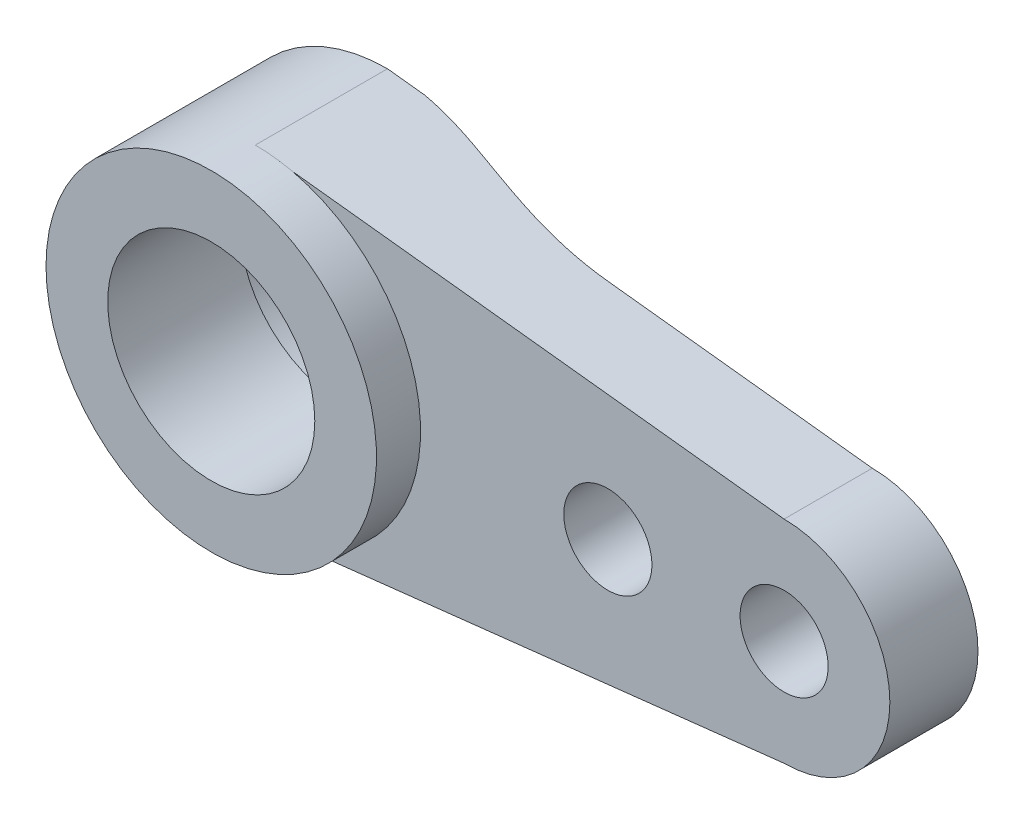
ISO-10303-21;
HEADER;
FILE_DESCRIPTION(('STEP AP214'),'2;1');
FILE_NAME('part.step','',(''),(''),'','','');
FILE_SCHEMA(('AUTOMOTIVE_DESIGN { 1 0 10303 214 1 1 1 1 }'));
ENDSEC;
DATA;
#1=APPLICATION_CONTEXT('core data for automotive mechanical design processes');
#2=APPLICATION_PROTOCOL_DEFINITION('international standard','automotive_design',2000,#1);
#3=PRODUCT_CONTEXT('',#1,'mechanical');
#4=PRODUCT('Part','Part','',(#3));
#5=PRODUCT_RELATED_PRODUCT_CATEGORY('part','',(#4));
#6=PRODUCT_DEFINITION_FORMATION('','',#4);
#7=PRODUCT_DEFINITION_CONTEXT('part definition',#1,'design');
#8=PRODUCT_DEFINITION('design','',#6,#7);
#9=PRODUCT_DEFINITION_SHAPE('','',#8);
#10=(LENGTH_UNIT() NAMED_UNIT(*) SI_UNIT(.MILLI.,.METRE.));
#11=(NAMED_UNIT(*) PLANE_ANGLE_UNIT() SI_UNIT($,.RADIAN.));
#12=(NAMED_UNIT(*) SI_UNIT($,.STERADIAN.) SOLID_ANGLE_UNIT());
#13=UNCERTAINTY_MEASURE_WITH_UNIT(LENGTH_MEASURE(1.E-05),#10,'distance_accuracy_value','');
#14=(GEOMETRIC_REPRESENTATION_CONTEXT(3) GLOBAL_UNCERTAINTY_ASSIGNED_CONTEXT((#13)) GLOBAL_UNIT_ASSIGNED_CONTEXT((#10,
#11,#12)) REPRESENTATION_CONTEXT('',''));
#15=CARTESIAN_POINT('',(0.,0.,0.));
#16=DIRECTION('',(0.,0.,1.));
#17=DIRECTION('',(1.,0.,0.));
#18=AXIS2_PLACEMENT_3D('',#15,#16,#17);
#19=CARTESIAN_POINT('',(0.,0.,0.));
#20=DIRECTION('',(0.,0.,1.));
#21=DIRECTION('',(1.,0.,0.));
#22=AXIS2_PLACEMENT_3D('',#19,#20,#21);
#23=PLANE('',#22);
#24=CARTESIAN_POINT('',(0.,0.,0.));
#25=DIRECTION('',(0.,0.,1.));
#26=DIRECTION('',(1.,0.,0.));
#27=AXIS2_PLACEMENT_3D('',#24,#25,#26);
#28=CIRCLE('',#27,2.35);
#29=CARTESIAN_POINT('',(2.35,0.,0.));
#30=VERTEX_POINT('',#29);
#31=EDGE_CURVE('E140',#30,#30,#28,.T.);
#32=ORIENTED_EDGE('',*,*,#31,.T.);
#33=EDGE_LOOP('',(#32));
#34=FACE_BOUND('',#33,.T.);
#35=CARTESIAN_POINT('',(0.,0.,0.));
#36=DIRECTION('',(0.,0.,-1.));
#37=DIRECTION('',(-1.,0.,0.));
#38=AXIS2_PLACEMENT_3D('',#35,#36,#37);
#39=CIRCLE('',#38,2.75);
#40=CARTESIAN_POINT('',(-2.75,0.,0.));
#41=VERTEX_POINT('',#40);
#42=EDGE_CURVE('E130',#41,#41,#39,.T.);
#43=ORIENTED_EDGE('',*,*,#42,.T.);
#44=EDGE_LOOP('',(#43));
#45=FACE_BOUND('',#44,.T.);
#46=ADVANCED_FACE('F43',(#34,#45),#23,.F.);
#47=CARTESIAN_POINT('',(0.416602376176516,-3.70313223268014,2.));
#48=DIRECTION('',(-0.111794773067865,0.993731316158802,0.));
#49=DIRECTION('',(-0.993731316158802,-0.111794773067865,0.));
#50=AXIS2_PLACEMENT_3D('',#47,#48,#49);
#51=PLANE('',#50);
#52=DIRECTION('',(0.,0.,-1.));
#53=VECTOR('',#52,1.);
#54=CARTESIAN_POINT('',(0.,-3.75,2.));
#55=LINE('',#54,#53);
#56=CARTESIAN_POINT('',(0.,-3.75,2.));
#57=VERTEX_POINT('',#56);
#58=CARTESIAN_POINT('',(0.,-3.75,-1.));
#59=VERTEX_POINT('',#58);
#60=EDGE_CURVE('E155',#57,#59,#55,.T.);
#61=ORIENTED_EDGE('',*,*,#60,.T.);
#62=DIRECTION('',(-0.993731316158802,-0.111794773067865,0.));
#63=VECTOR('',#62,1.);
#64=CARTESIAN_POINT('',(0.416602376176516,-3.70313223268014,-1.));
#65=LINE('',#64,#63);
#66=CARTESIAN_POINT('',(0.833204752353025,-3.65626446536029,-1.));
#67=VERTEX_POINT('',#66);
#68=EDGE_CURVE('E123',#67,#59,#65,.T.);
#69=ORIENTED_EDGE('',*,*,#68,.F.);
#70=CARTESIAN_POINT('',(0.833204752353025,-3.65626446536029,-1.));
#71=CARTESIAN_POINT('',(0.909269143867285,-3.64770722131493,-0.993596184741322));
#72=CARTESIAN_POINT('',(0.985173396160932,-3.63916799293189,-0.985484022903696));
#73=CARTESIAN_POINT('',(1.13656233272101,-3.62213673756889,-0.96622073834263));
#74=CARTESIAN_POINT('',(1.21204721518648,-3.61364468829152,-0.955071202978285));
#75=CARTESIAN_POINT('',(1.43743829110821,-3.58828819225033,-0.917686658305599));
#76=CARTESIAN_POINT('',(1.58669012927892,-3.57149736045612,-0.887477264223628));
#77=CARTESIAN_POINT('',(1.88336481905507,-3.53812145785631,-0.820000005463483));
#78=CARTESIAN_POINT('',(2.03078946636579,-3.52153618503385,-0.782739773112954));
#79=CARTESIAN_POINT('',(2.32473500106725,-3.48846731237994,-0.704435446481078));
#80=CARTESIAN_POINT('',(2.47125515498987,-3.47198379506364,-0.663388625974831));
#81=CARTESIAN_POINT('',(2.76253629125785,-3.43921466723349,-0.580778931123469));
#82=CARTESIAN_POINT('',(2.90730000457825,-3.42292874948495,-0.539225556425079));
#83=CARTESIAN_POINT('',(3.19717571448482,-3.39031773212046,-0.457461563133805));
#84=CARTESIAN_POINT('',(3.34228763100725,-3.37399264151168,-0.41725066264553));
#85=CARTESIAN_POINT('',(3.63325089927632,-3.34125927383141,-0.340051758031749));
#86=CARTESIAN_POINT('',(3.77910160912391,-3.32485106897356,-0.303061340545608));
#87=CARTESIAN_POINT('',(4.07191533962057,-3.29190952429269,-0.233828706896925));
#88=CARTESIAN_POINT('',(4.21887826393729,-3.27537619530706,-0.201586084351559));
#89=CARTESIAN_POINT('',(4.5015178987499,-3.24357923639064,-0.14564338091041));
#90=CARTESIAN_POINT('',(4.6370974317928,-3.22832653892331,-0.12145133160424));
#91=CARTESIAN_POINT('',(4.90921858535427,-3.19771290914764,-0.0790301626686992));
#92=CARTESIAN_POINT('',(5.04576042766733,-3.18235195188743,-0.0608024668983543));
#93=CARTESIAN_POINT('',(5.31993780668812,-3.15150699674759,-0.0310616277464491));
#94=CARTESIAN_POINT('',(5.45757526034614,-3.13602278321106,-0.0195660011731214));
#95=CARTESIAN_POINT('',(5.7332769600308,-3.10500634199654,-0.00402638083015973));
#96=CARTESIAN_POINT('',(5.87134125867459,-3.08947410839911,1.66543193867271E-05));
#97=CARTESIAN_POINT('',(6.00944318334679,-3.07393764187349,0.));
#98=B_SPLINE_CURVE_WITH_KNOTS('',3,(#70,#71,#72,#73,#74,#75,#76,#77,#78,#79,#80,#81,#82,#83,#84,
#85,#86,#87,#88,#89,#90,#91,#92,#93,#94,#95,#96,#97),.UNSPECIFIED.,.F.,.F.,(4,2,2,2,2,2,2,2,2,2,
2,2,2,4),(0.,0.23038838188231,0.460656590912976,0.919955472243346,1.37875999081093,
1.837897451399,2.29236346152078,2.74673343395963,3.20075992670152,3.65474753487603,
4.07032264439236,4.48599689112312,4.90274796884188,5.31955264913473),.UNSPECIFIED.);
#99=CARTESIAN_POINT('',(6.0094431833468,-3.07393764187349,0.));
#100=VERTEX_POINT('',#99);
#101=EDGE_CURVE('E57',#67,#100,#98,.T.);
#102=ORIENTED_EDGE('',*,*,#101,.T.);
#103=DIRECTION('',(0.993731316158802,0.111794773067865,0.));
#104=VECTOR('',#103,1.);
#105=CARTESIAN_POINT('',(0.416602376176516,-3.70313223268014,0.));
#106=LINE('',#105,#104);
#107=CARTESIAN_POINT('',(12.,-2.4,0.));
#108=VERTEX_POINT('',#107);
#109=EDGE_CURVE('E158',#100,#108,#106,.T.);
#110=ORIENTED_EDGE('',*,*,#109,.T.);
#111=DIRECTION('',(0.,0.,-1.));
#112=VECTOR('',#111,1.);
#113=CARTESIAN_POINT('',(12.,-2.4,2.));
#114=LINE('',#113,#112);
#115=CARTESIAN_POINT('',(12.,-2.4,2.));
#116=VERTEX_POINT('',#115);
#117=EDGE_CURVE('E169',#116,#108,#114,.T.);
#118=ORIENTED_EDGE('',*,*,#117,.F.);
#119=DIRECTION('',(0.993731316158802,0.111794773067865,0.));
#120=VECTOR('',#119,1.);
#121=CARTESIAN_POINT('',(0.416602376176516,-3.70313223268014,2.));
#122=LINE('',#121,#120);
#123=CARTESIAN_POINT('',(0.833204752353025,-3.65626446536029,2.));
#124=VERTEX_POINT('',#123);
#125=EDGE_CURVE('E149',#124,#116,#122,.T.);
#126=ORIENTED_EDGE('',*,*,#125,.F.);
#127=EDGE_CURVE('E145',#57,#124,#122,.T.);
#128=ORIENTED_EDGE('',*,*,#127,.F.);
#129=EDGE_LOOP('',(#61,#69,#102,#110,#118,#126,#128));
#130=FACE_BOUND('',#129,.T.);
#131=ADVANCED_FACE('F177',(#130),#51,.F.);
#132=CARTESIAN_POINT('',(12.,0.,2.));
#133=DIRECTION('',(0.,0.,-1.));
#134=DIRECTION('',(-1.,0.,0.));
#135=AXIS2_PLACEMENT_3D('',#132,#133,#134);
#136=CYLINDRICAL_SURFACE('',#135,2.4);
#137=CARTESIAN_POINT('',(12.,0.,0.));
#138=DIRECTION('',(0.,0.,1.));
#139=DIRECTION('',(1.,0.,0.));
#140=AXIS2_PLACEMENT_3D('',#137,#138,#139);
#141=CIRCLE('',#140,2.4);
#142=CARTESIAN_POINT('',(12.,2.4,0.));
#143=VERTEX_POINT('',#142);
#144=EDGE_CURVE('E160',#108,#143,#141,.T.);
#145=ORIENTED_EDGE('',*,*,#144,.T.);
#146=DIRECTION('',(0.,0.,-1.));
#147=VECTOR('',#146,1.);
#148=CARTESIAN_POINT('',(12.,2.4,2.));
#149=LINE('',#148,#147);
#150=CARTESIAN_POINT('',(12.,2.4,2.));
#151=VERTEX_POINT('',#150);
#152=EDGE_CURVE('E167',#151,#143,#149,.T.);
#153=ORIENTED_EDGE('',*,*,#152,.F.);
#154=CARTESIAN_POINT('',(12.,0.,2.));
#155=DIRECTION('',(0.,0.,1.));
#156=DIRECTION('',(1.,0.,0.));
#157=AXIS2_PLACEMENT_3D('',#154,#155,#156);
#158=CIRCLE('',#157,2.4);
#159=EDGE_CURVE('E148',#116,#151,#158,.T.);
#160=ORIENTED_EDGE('',*,*,#159,.F.);
#161=ORIENTED_EDGE('',*,*,#117,.T.);
#162=EDGE_LOOP('',(#145,#153,#160,#161));
#163=FACE_BOUND('',#162,.T.);
#164=ADVANCED_FACE('F181',(#163),#136,.T.);
#165=CARTESIAN_POINT('',(0.416602376176516,3.70313223268014,2.));
#166=DIRECTION('',(0.111794773067865,0.993731316158802,0.));
#167=DIRECTION('',(-0.993731316158802,0.111794773067865,0.));
#168=AXIS2_PLACEMENT_3D('',#165,#166,#167);
#169=PLANE('',#168);
#170=DIRECTION('',(0.993731316158802,-0.111794773067865,0.));
#171=VECTOR('',#170,1.);
#172=CARTESIAN_POINT('',(0.416602376176516,3.70313223268014,0.));
#173=LINE('',#172,#171);
#174=CARTESIAN_POINT('',(6.0094431833468,3.07393764187349,0.));
#175=VERTEX_POINT('',#174);
#176=EDGE_CURVE('E110',#175,#143,#173,.T.);
#177=ORIENTED_EDGE('',*,*,#176,.F.);
#178=CARTESIAN_POINT('',(6.00944318334679,3.07393764187348,0.));
#179=CARTESIAN_POINT('',(5.91813796752721,3.08420947865319,1.71492627746162E-06));
#180=CARTESIAN_POINT('',(5.82684515161617,3.09447992044318,-0.00176106629165869));
#181=CARTESIAN_POINT('',(5.64440130937267,3.11500485269557,-0.00863893848324445));
#182=CARTESIAN_POINT('',(5.55325025860992,3.12525934590638,-0.0137533676929452));
#183=CARTESIAN_POINT('',(5.28042185087903,3.15595254177611,-0.0338388981337057));
#184=CARTESIAN_POINT('',(5.09907705782105,3.17635383099513,-0.0535533786847354));
#185=CARTESIAN_POINT('',(4.73837484386883,3.21693283006476,-0.103904001807229));
#186=CARTESIAN_POINT('',(4.55901378141403,3.23711094959092,-0.134514633370861));
#187=CARTESIAN_POINT('',(4.20198601308218,3.27727657352826,-0.204697342469294));
#188=CARTESIAN_POINT('',(4.02432002319338,3.29726399739075,-0.244273046089204));
#189=CARTESIAN_POINT('',(3.72233353783955,3.33123747699305,-0.317452527156588));
#190=CARTESIAN_POINT('',(3.59761104264699,3.34526875770221,-0.349416763354984));
#191=CARTESIAN_POINT('',(3.34877028253215,3.37326334321513,-0.415632961721695));
#192=CARTESIAN_POINT('',(3.224652021706,3.38722664755807,-0.449884939375599));
#193=CARTESIAN_POINT('',(2.97679970140245,3.41511003359222,-0.51950427764003));
#194=CARTESIAN_POINT('',(2.85306547473686,3.4290301340921,-0.554871044627114));
#195=CARTESIAN_POINT('',(2.60551262902233,3.45687982923499,-0.625385264992095));
#196=CARTESIAN_POINT('',(2.48169399947595,3.47080942505896,-0.660532681530152));
#197=CARTESIAN_POINT('',(2.23275882983511,3.49881463164355,-0.729215908077185));
#198=CARTESIAN_POINT('',(2.10763904455542,3.51289060748752,-0.762740038322608));
#199=CARTESIAN_POINT('',(1.85650468882917,3.54114322250672,-0.826011461880733));
#200=CARTESIAN_POINT('',(1.73049056672853,3.55531981124304,-0.855760523485548));
#201=CARTESIAN_POINT('',(1.47672894778516,3.58386799337417,-0.90946492956673));
#202=CARTESIAN_POINT('',(1.34897684178702,3.59824010529896,-0.933399015475168));
#203=CARTESIAN_POINT('',(1.15633249721669,3.61991259406312,-0.963248731789523));
#204=CARTESIAN_POINT('',(1.09190294599026,3.6271609185761,-0.972194201634583));
#205=CARTESIAN_POINT('',(0.962754916070984,3.64169007194201,-0.987838910123925));
#206=CARTESIAN_POINT('',(0.898036349615484,3.64897091066826,-0.994537411717281));
#207=CARTESIAN_POINT('',(0.833204752353025,3.65626446536028,-0.999999999999999));
#208=B_SPLINE_CURVE_WITH_KNOTS('',3,(#178,#179,#180,#181,#182,#183,#184,#185,#186,#187,#188,
#189,#190,#191,#192,#193,#194,#195,#196,#197,#198,#199,#200,#201,#202,#203,#204,#205,#206,#207),
.UNSPECIFIED.,.F.,.F.,(4,2,2,2,2,2,2,2,2,2,2,2,2,2,4),(0.,0.275605398642001,0.551156396944584,
1.10137834818224,1.65032045512452,2.1994849892973,2.58800672337424,2.97653108759861,
3.36485194672408,3.75323635792054,4.14409244973545,4.53476477821729,4.92684454397807,
5.12315914608114,5.31953808050804),.UNSPECIFIED.);
#209=CARTESIAN_POINT('',(0.833204752353025,3.65626446536029,-1.));
#210=VERTEX_POINT('',#209);
#211=EDGE_CURVE('E11',#175,#210,#208,.T.);
#212=ORIENTED_EDGE('',*,*,#211,.T.);
#213=DIRECTION('',(0.993731316158802,-0.111794773067865,0.));
#214=VECTOR('',#213,1.);
#215=CARTESIAN_POINT('',(0.416602376176516,3.70313223268014,-1.));
#216=LINE('',#215,#214);
#217=CARTESIAN_POINT('',(0.,3.75,-1.));
#218=VERTEX_POINT('',#217);
#219=EDGE_CURVE('E108',#218,#210,#216,.T.);
#220=ORIENTED_EDGE('',*,*,#219,.F.);
#221=DIRECTION('',(0.,0.,-1.));
#222=VECTOR('',#221,1.);
#223=CARTESIAN_POINT('',(0.,3.75,2.));
#224=LINE('',#223,#222);
#225=CARTESIAN_POINT('',(0.,3.75,2.));
#226=VERTEX_POINT('',#225);
#227=EDGE_CURVE('E165',#226,#218,#224,.T.);
#228=ORIENTED_EDGE('',*,*,#227,.F.);
#229=DIRECTION('',(0.993731316158802,-0.111794773067865,0.));
#230=VECTOR('',#229,1.);
#231=CARTESIAN_POINT('',(0.416602376176516,3.70313223268014,2.));
#232=LINE('',#231,#230);
#233=CARTESIAN_POINT('',(0.833204752353024,3.65626446536028,2.));
#234=VERTEX_POINT('',#233);
#235=EDGE_CURVE('E153',#226,#234,#232,.T.);
#236=ORIENTED_EDGE('',*,*,#235,.T.);
#237=EDGE_CURVE('E152',#234,#151,#232,.T.);
#238=ORIENTED_EDGE('',*,*,#237,.T.);
#239=ORIENTED_EDGE('',*,*,#152,.T.);
#240=EDGE_LOOP('',(#177,#212,#220,#228,#236,#238,#239));
#241=FACE_BOUND('',#240,.T.);
#242=ADVANCED_FACE('F107',(#241),#169,.T.);
#243=CARTESIAN_POINT('',(0.,0.,2.));
#244=DIRECTION('',(0.,0.,-1.));
#245=DIRECTION('',(-1.,0.,0.));
#246=AXIS2_PLACEMENT_3D('',#243,#244,#245);
#247=CYLINDRICAL_SURFACE('',#246,2.35);
#248=ORIENTED_EDGE('',*,*,#31,.F.);
#249=EDGE_LOOP('',(#248));
#250=FACE_BOUND('',#249,.T.);
#251=CARTESIAN_POINT('',(0.,0.,3.));
#252=DIRECTION('',(0.,0.,1.));
#253=DIRECTION('',(1.,0.,0.));
#254=AXIS2_PLACEMENT_3D('',#251,#252,#253);
#255=CIRCLE('',#254,2.35);
#256=CARTESIAN_POINT('',(2.35,0.,3.));
#257=VERTEX_POINT('',#256);
#258=EDGE_CURVE('E129',#257,#257,#255,.T.);
#259=ORIENTED_EDGE('',*,*,#258,.T.);
#260=EDGE_LOOP('',(#259));
#261=FACE_BOUND('',#260,.T.);
#262=ADVANCED_FACE('F182',(#250,#261),#247,.F.);
#263=CARTESIAN_POINT('',(0.,0.,2.));
#264=DIRECTION('',(0.,0.,-1.));
#265=DIRECTION('',(-1.,0.,0.));
#266=AXIS2_PLACEMENT_3D('',#263,#264,#265);
#267=CYLINDRICAL_SURFACE('',#266,3.75);
#268=ORIENTED_EDGE('',*,*,#227,.T.);
#269=CARTESIAN_POINT('',(0.,0.,-1.));
#270=DIRECTION('',(0.,0.,-1.));
#271=DIRECTION('',(-1.,0.,0.));
#272=AXIS2_PLACEMENT_3D('',#269,#270,#271);
#273=CIRCLE('',#272,3.75);
#274=EDGE_CURVE('E120',#59,#218,#273,.T.);
#275=ORIENTED_EDGE('',*,*,#274,.F.);
#276=ORIENTED_EDGE('',*,*,#60,.F.);
#277=CARTESIAN_POINT('',(0.,0.,2.));
#278=DIRECTION('',(0.,0.,1.));
#279=DIRECTION('',(1.,0.,0.));
#280=AXIS2_PLACEMENT_3D('',#277,#278,#279);
#281=CIRCLE('',#280,3.75);
#282=EDGE_CURVE('E136',#57,#124,#281,.T.);
#283=ORIENTED_EDGE('',*,*,#282,.T.);
#284=EDGE_CURVE('E144',#124,#234,#281,.T.);
#285=ORIENTED_EDGE('',*,*,#284,.T.);
#286=EDGE_CURVE('E141',#234,#226,#281,.T.);
#287=ORIENTED_EDGE('',*,*,#286,.T.);
#288=EDGE_LOOP('',(#268,#275,#276,#283,#285,#287));
#289=FACE_BOUND('',#288,.T.);
#290=CARTESIAN_POINT('',(0.,0.,3.));
#291=DIRECTION('',(0.,0.,1.));
#292=DIRECTION('',(-1.,0.,0.));
#293=AXIS2_PLACEMENT_3D('',#290,#291,#292);
#294=CIRCLE('',#293,3.75);
#295=CARTESIAN_POINT('',(-3.75,0.,3.));
#296=VERTEX_POINT('',#295);
#297=EDGE_CURVE('E137',#296,#296,#294,.T.);
#298=ORIENTED_EDGE('',*,*,#297,.F.);
#299=EDGE_LOOP('',(#298));
#300=FACE_BOUND('',#299,.T.);
#301=ADVANCED_FACE('F184',(#289,#300),#267,.T.);
#302=CARTESIAN_POINT('',(0.,0.,2.));
#303=DIRECTION('',(0.,0.,1.));
#304=DIRECTION('',(1.,0.,0.));
#305=AXIS2_PLACEMENT_3D('',#302,#303,#304);
#306=PLANE('',#305);
#307=CARTESIAN_POINT('',(12.,0.,2.));
#308=DIRECTION('',(0.,0.,1.));
#309=DIRECTION('',(1.,0.,0.));
#310=AXIS2_PLACEMENT_3D('',#307,#308,#309);
#311=CIRCLE('',#310,1.);
#312=CARTESIAN_POINT('',(11.,0.,2.));
#313=VERTEX_POINT('',#312);
#314=EDGE_CURVE('E263',#313,#313,#311,.F.);
#315=ORIENTED_EDGE('',*,*,#314,.T.);
#316=EDGE_LOOP('',(#315));
#317=FACE_BOUND('',#316,.T.);
#318=CARTESIAN_POINT('',(8.,0.,2.));
#319=DIRECTION('',(0.,0.,1.));
#320=DIRECTION('',(1.,0.,0.));
#321=AXIS2_PLACEMENT_3D('',#318,#319,#320);
#322=CIRCLE('',#321,1.);
#323=CARTESIAN_POINT('',(7.,0.,2.));
#324=VERTEX_POINT('',#323);
#325=EDGE_CURVE('E268',#324,#324,#322,.F.);
#326=ORIENTED_EDGE('',*,*,#325,.T.);
#327=EDGE_LOOP('',(#326));
#328=FACE_BOUND('',#327,.T.);
#329=ORIENTED_EDGE('',*,*,#284,.F.);
#330=ORIENTED_EDGE('',*,*,#125,.T.);
#331=ORIENTED_EDGE('',*,*,#159,.T.);
#332=ORIENTED_EDGE('',*,*,#237,.F.);
#333=EDGE_LOOP('',(#329,#330,#331,#332));
#334=FACE_BOUND('',#333,.T.);
#335=ADVANCED_FACE('F190',(#317,#328,#334),#306,.T.);
#336=CARTESIAN_POINT('',(12.,0.,0.));
#337=DIRECTION('',(0.,0.,-1.));
#338=DIRECTION('',(-1.,0.,0.));
#339=AXIS2_PLACEMENT_3D('',#336,#337,#338);
#340=CIRCLE('',#339,1.);
#341=CARTESIAN_POINT('',(11.,0.,0.));
#342=VERTEX_POINT('',#341);
#343=EDGE_CURVE('E133',#342,#342,#340,.T.);
#344=ORIENTED_EDGE('',*,*,#343,.F.);
#345=EDGE_LOOP('',(#344));
#346=FACE_BOUND('',#345,.T.);
#347=CARTESIAN_POINT('',(8.,0.,0.));
#348=DIRECTION('',(0.,0.,-1.));
#349=DIRECTION('',(-1.,0.,0.));
#350=AXIS2_PLACEMENT_3D('',#347,#348,#349);
#351=CIRCLE('',#350,1.);
#352=CARTESIAN_POINT('',(7.,0.,0.));
#353=VERTEX_POINT('',#352);
#354=EDGE_CURVE('E220',#353,#353,#351,.T.);
#355=ORIENTED_EDGE('',*,*,#354,.F.);
#356=EDGE_LOOP('',(#355));
#357=FACE_BOUND('',#356,.T.);
#358=ORIENTED_EDGE('',*,*,#109,.F.);
#359=CARTESIAN_POINT('',(0.,0.,0.));
#360=DIRECTION('',(0.,0.,1.));
#361=DIRECTION('',(1.,0.,0.));
#362=AXIS2_PLACEMENT_3D('',#359,#360,#361);
#363=CIRCLE('',#362,6.75);
#364=EDGE_CURVE('E70',#100,#175,#363,.T.);
#365=ORIENTED_EDGE('',*,*,#364,.T.);
#366=ORIENTED_EDGE('',*,*,#176,.T.);
#367=ORIENTED_EDGE('',*,*,#144,.F.);
#368=EDGE_LOOP('',(#358,#365,#366,#367));
#369=FACE_BOUND('',#368,.T.);
#370=ADVANCED_FACE('F198',(#346,#357,#369),#23,.F.);
#371=CARTESIAN_POINT('',(0.,0.,2.));
#372=DIRECTION('',(0.,0.,-1.));
#373=DIRECTION('',(-1.,0.,0.));
#374=AXIS2_PLACEMENT_3D('',#371,#372,#373);
#375=PLANE('',#374);
#376=ORIENTED_EDGE('',*,*,#235,.F.);
#377=ORIENTED_EDGE('',*,*,#286,.F.);
#378=EDGE_LOOP('',(#376,#377));
#379=FACE_BOUND('',#378,.T.);
#380=ADVANCED_FACE('F204',(#379),#375,.T.);
#381=CARTESIAN_POINT('',(0.,0.,3.));
#382=DIRECTION('',(0.,0.,-1.));
#383=DIRECTION('',(-1.,0.,0.));
#384=AXIS2_PLACEMENT_3D('',#381,#382,#383);
#385=PLANE('',#384);
#386=ORIENTED_EDGE('',*,*,#297,.T.);
#387=EDGE_LOOP('',(#386));
#388=FACE_BOUND('',#387,.T.);
#389=ORIENTED_EDGE('',*,*,#258,.F.);
#390=EDGE_LOOP('',(#389));
#391=FACE_BOUND('',#390,.T.);
#392=ADVANCED_FACE('F210',(#388,#391),#385,.F.);
#393=ORIENTED_EDGE('',*,*,#282,.F.);
#394=ORIENTED_EDGE('',*,*,#127,.T.);
#395=EDGE_LOOP('',(#393,#394));
#396=FACE_BOUND('',#395,.T.);
#397=ADVANCED_FACE('F213',(#396),#375,.T.);
#398=CARTESIAN_POINT('',(0.,0.,-1.));
#399=DIRECTION('',(0.,0.,1.));
#400=DIRECTION('',(1.,0.,0.));
#401=AXIS2_PLACEMENT_3D('',#398,#399,#400);
#402=CYLINDRICAL_SURFACE('',#401,2.75);
#403=CARTESIAN_POINT('',(0.,0.,-1.));
#404=DIRECTION('',(0.,0.,-1.));
#405=DIRECTION('',(-1.,0.,0.));
#406=AXIS2_PLACEMENT_3D('',#403,#404,#405);
#407=CIRCLE('',#406,2.75);
#408=CARTESIAN_POINT('',(-2.75,0.,-1.));
#409=VERTEX_POINT('',#408);
#410=EDGE_CURVE('E121',#409,#409,#407,.T.);
#411=ORIENTED_EDGE('',*,*,#410,.T.);
#412=EDGE_LOOP('',(#411));
#413=FACE_BOUND('',#412,.T.);
#414=ORIENTED_EDGE('',*,*,#42,.F.);
#415=EDGE_LOOP('',(#414));
#416=FACE_BOUND('',#415,.T.);
#417=ADVANCED_FACE('F238',(#413,#416),#402,.F.);
#418=CARTESIAN_POINT('',(0.,0.,-1.));
#419=DIRECTION('',(0.,0.,-1.));
#420=DIRECTION('',(-1.,0.,0.));
#421=AXIS2_PLACEMENT_3D('',#418,#419,#420);
#422=PLANE('',#421);
#423=ORIENTED_EDGE('',*,*,#410,.F.);
#424=EDGE_LOOP('',(#423));
#425=FACE_BOUND('',#424,.T.);
#426=ORIENTED_EDGE('',*,*,#219,.T.);
#427=CARTESIAN_POINT('',(0.,0.,-1.));
#428=DIRECTION('',(0.,0.,-1.));
#429=DIRECTION('',(-1.,0.,0.));
#430=AXIS2_PLACEMENT_3D('',#427,#428,#429);
#431=CIRCLE('',#430,3.75);
#432=EDGE_CURVE('E118',#210,#67,#431,.T.);
#433=ORIENTED_EDGE('',*,*,#432,.T.);
#434=ORIENTED_EDGE('',*,*,#68,.T.);
#435=ORIENTED_EDGE('',*,*,#274,.T.);
#436=EDGE_LOOP('',(#426,#433,#434,#435));
#437=FACE_BOUND('',#436,.T.);
#438=ADVANCED_FACE('F116',(#425,#437),#422,.T.);
#439=CARTESIAN_POINT('',(0.,0.,-5.));
#440=DIRECTION('',(0.,0.,1.));
#441=DIRECTION('',(1.,0.,0.));
#442=AXIS2_PLACEMENT_3D('',#439,#440,#441);
#443=TOROIDAL_SURFACE('',#442,6.75,5.);
#444=ORIENTED_EDGE('',*,*,#211,.F.);
#445=ORIENTED_EDGE('',*,*,#364,.F.);
#446=ORIENTED_EDGE('',*,*,#101,.F.);
#447=ORIENTED_EDGE('',*,*,#432,.F.);
#448=EDGE_LOOP('',(#444,#445,#446,#447));
#449=FACE_BOUND('',#448,.T.);
#450=ADVANCED_FACE('F45',(#449),#443,.F.);
#451=CARTESIAN_POINT('',(8.,0.,3.001));
#452=DIRECTION('',(0.,0.,-1.));
#453=DIRECTION('',(-1.,0.,0.));
#454=AXIS2_PLACEMENT_3D('',#451,#452,#453);
#455=CYLINDRICAL_SURFACE('',#454,1.);
#456=CARTESIAN_POINT('',(7.,0.,2.));
#457=CARTESIAN_POINT('',(7.,0.,1.97916666666667));
#458=CARTESIAN_POINT('',(7.,0.,1.95833333333333));
#459=CARTESIAN_POINT('',(7.,0.,1.91666666666667));
#460=CARTESIAN_POINT('',(7.,0.,1.89583333333333));
#461=CARTESIAN_POINT('',(7.,0.,1.85416666666667));
#462=CARTESIAN_POINT('',(7.,0.,1.83333333333333));
#463=CARTESIAN_POINT('',(7.,0.,1.79166666666667));
#464=CARTESIAN_POINT('',(7.,0.,1.77083333333333));
#465=CARTESIAN_POINT('',(7.,0.,1.72916666666667));
#466=CARTESIAN_POINT('',(7.,0.,1.70833333333333));
#467=CARTESIAN_POINT('',(7.,0.,1.66666666666667));
#468=CARTESIAN_POINT('',(7.,0.,1.64583333333333));
#469=CARTESIAN_POINT('',(7.,0.,1.60416666666667));
#470=CARTESIAN_POINT('',(7.,0.,1.58333333333333));
#471=CARTESIAN_POINT('',(7.,0.,1.54166666666667));
#472=CARTESIAN_POINT('',(7.,0.,1.52083333333333));
#473=CARTESIAN_POINT('',(7.,0.,1.47916666666667));
#474=CARTESIAN_POINT('',(7.,0.,1.45833333333333));
#475=CARTESIAN_POINT('',(7.,0.,1.41666666666667));
#476=CARTESIAN_POINT('',(7.,0.,1.39583333333333));
#477=CARTESIAN_POINT('',(7.,0.,1.35416666666667));
#478=CARTESIAN_POINT('',(7.,0.,1.33333333333333));
#479=CARTESIAN_POINT('',(7.,0.,1.29166666666667));
#480=CARTESIAN_POINT('',(7.,0.,1.27083333333333));
#481=CARTESIAN_POINT('',(7.,0.,1.22916666666667));
#482=CARTESIAN_POINT('',(7.,0.,1.20833333333333));
#483=CARTESIAN_POINT('',(7.,0.,1.16666666666667));
#484=CARTESIAN_POINT('',(7.,0.,1.14583333333333));
#485=CARTESIAN_POINT('',(7.,0.,1.10416666666667));
#486=CARTESIAN_POINT('',(7.,0.,1.08333333333333));
#487=CARTESIAN_POINT('',(7.,0.,1.04166666666667));
#488=CARTESIAN_POINT('',(7.,0.,1.02083333333333));
#489=CARTESIAN_POINT('',(7.,0.,0.979166666666667));
#490=CARTESIAN_POINT('',(7.,0.,0.958333333333334));
#491=CARTESIAN_POINT('',(7.,0.,0.916666666666667));
#492=CARTESIAN_POINT('',(7.,0.,0.895833333333334));
#493=CARTESIAN_POINT('',(7.,0.,0.854166666666667));
#494=CARTESIAN_POINT('',(7.,0.,0.833333333333334));
#495=CARTESIAN_POINT('',(7.,0.,0.791666666666667));
#496=CARTESIAN_POINT('',(7.,0.,0.770833333333334));
#497=CARTESIAN_POINT('',(7.,0.,0.729166666666667));
#498=CARTESIAN_POINT('',(7.,0.,0.708333333333333));
#499=CARTESIAN_POINT('',(7.,0.,0.666666666666667));
#500=CARTESIAN_POINT('',(7.,0.,0.645833333333333));
#501=CARTESIAN_POINT('',(7.,0.,0.604166666666667));
#502=CARTESIAN_POINT('',(7.,0.,0.583333333333333));
#503=CARTESIAN_POINT('',(7.,0.,0.541666666666667));
#504=CARTESIAN_POINT('',(7.,0.,0.520833333333334));
#505=CARTESIAN_POINT('',(7.,0.,0.479166666666667));
#506=CARTESIAN_POINT('',(7.,0.,0.458333333333334));
#507=CARTESIAN_POINT('',(7.,0.,0.416666666666667));
#508=CARTESIAN_POINT('',(7.,0.,0.395833333333334));
#509=CARTESIAN_POINT('',(7.,0.,0.354166666666667));
#510=CARTESIAN_POINT('',(7.,0.,0.333333333333334));
#511=CARTESIAN_POINT('',(7.,0.,0.291666666666667));
#512=CARTESIAN_POINT('',(7.,0.,0.270833333333334));
#513=CARTESIAN_POINT('',(7.,0.,0.229166666666667));
#514=CARTESIAN_POINT('',(7.,0.,0.208333333333334));
#515=CARTESIAN_POINT('',(7.,0.,0.166666666666667));
#516=CARTESIAN_POINT('',(7.,0.,0.145833333333334));
#517=CARTESIAN_POINT('',(7.,0.,0.104166666666667));
#518=CARTESIAN_POINT('',(7.,0.,0.0833333333333338));
#519=CARTESIAN_POINT('',(7.,0.,0.0416666666666671));
#520=CARTESIAN_POINT('',(7.,0.,0.0208333333333338));
#521=CARTESIAN_POINT('',(7.,0.,0.));
#522=B_SPLINE_CURVE_WITH_KNOTS('',3,(#456,#457,#458,#459,#460,#461,#462,#463,#464,#465,#466,
#467,#468,#469,#470,#471,#472,#473,#474,#475,#476,#477,#478,#479,#480,#481,#482,#483,#484,#485,
#486,#487,#488,#489,#490,#491,#492,#493,#494,#495,#496,#497,#498,#499,#500,#501,#502,#503,#504,
#505,#506,#507,#508,#509,#510,#511,#512,#513,#514,#515,#516,#517,#518,#519,#520,#521),
.UNSPECIFIED.,.F.,.F.,(4,2,2,2,2,2,2,2,2,2,2,2,2,2,2,2,2,2,2,2,2,2,2,2,2,2,2,2,2,2,2,2,4),(0.,
0.0625000000000003,0.125,0.1875,0.25,0.3125,0.375,0.4375,0.5,0.5625,0.625,0.6875,0.75,0.8125,
0.875,0.9375,1.,1.0625,1.125,1.1875,1.25,1.3125,1.375,1.4375,1.5,1.5625,1.625,1.6875,1.75,
1.8125,1.875,1.9375,2.),.UNSPECIFIED.);
#523=EDGE_CURVE('BSEAM251',#324,#353,#522,.T.);
#524=ORIENTED_EDGE('',*,*,#325,.F.);
#525=ORIENTED_EDGE('',*,*,#354,.T.);
#526=ORIENTED_EDGE('',*,*,#523,.T.);
#527=ORIENTED_EDGE('',*,*,#523,.F.);
#528=EDGE_LOOP('',(#524,#526,#525,#527));
#529=FACE_BOUND('',#528,.T.);
#530=ADVANCED_FACE('F251',(#529),#455,.F.);
#531=CARTESIAN_POINT('',(12.,0.,3.001));
#532=DIRECTION('',(0.,0.,-1.));
#533=DIRECTION('',(-1.,0.,0.));
#534=AXIS2_PLACEMENT_3D('',#531,#532,#533);
#535=CYLINDRICAL_SURFACE('',#534,1.);
#536=CARTESIAN_POINT('',(11.,0.,2.));
#537=CARTESIAN_POINT('',(11.,0.,1.97916666666667));
#538=CARTESIAN_POINT('',(11.,0.,1.95833333333333));
#539=CARTESIAN_POINT('',(11.,0.,1.91666666666667));
#540=CARTESIAN_POINT('',(11.,0.,1.89583333333333));
#541=CARTESIAN_POINT('',(11.,0.,1.85416666666667));
#542=CARTESIAN_POINT('',(11.,0.,1.83333333333333));
#543=CARTESIAN_POINT('',(11.,0.,1.79166666666667));
#544=CARTESIAN_POINT('',(11.,0.,1.77083333333333));
#545=CARTESIAN_POINT('',(11.,0.,1.72916666666667));
#546=CARTESIAN_POINT('',(11.,0.,1.70833333333333));
#547=CARTESIAN_POINT('',(11.,0.,1.66666666666667));
#548=CARTESIAN_POINT('',(11.,0.,1.64583333333333));
#549=CARTESIAN_POINT('',(11.,0.,1.60416666666667));
#550=CARTESIAN_POINT('',(11.,0.,1.58333333333333));
#551=CARTESIAN_POINT('',(11.,0.,1.54166666666667));
#552=CARTESIAN_POINT('',(11.,0.,1.52083333333333));
#553=CARTESIAN_POINT('',(11.,0.,1.47916666666667));
#554=CARTESIAN_POINT('',(11.,0.,1.45833333333333));
#555=CARTESIAN_POINT('',(11.,0.,1.41666666666667));
#556=CARTESIAN_POINT('',(11.,0.,1.39583333333333));
#557=CARTESIAN_POINT('',(11.,0.,1.35416666666667));
#558=CARTESIAN_POINT('',(11.,0.,1.33333333333333));
#559=CARTESIAN_POINT('',(11.,0.,1.29166666666667));
#560=CARTESIAN_POINT('',(11.,0.,1.27083333333333));
#561=CARTESIAN_POINT('',(11.,0.,1.22916666666667));
#562=CARTESIAN_POINT('',(11.,0.,1.20833333333333));
#563=CARTESIAN_POINT('',(11.,0.,1.16666666666667));
#564=CARTESIAN_POINT('',(11.,0.,1.14583333333333));
#565=CARTESIAN_POINT('',(11.,0.,1.10416666666667));
#566=CARTESIAN_POINT('',(11.,0.,1.08333333333333));
#567=CARTESIAN_POINT('',(11.,0.,1.04166666666667));
#568=CARTESIAN_POINT('',(11.,0.,1.02083333333333));
#569=CARTESIAN_POINT('',(11.,0.,0.979166666666667));
#570=CARTESIAN_POINT('',(11.,0.,0.958333333333334));
#571=CARTESIAN_POINT('',(11.,0.,0.916666666666667));
#572=CARTESIAN_POINT('',(11.,0.,0.895833333333334));
#573=CARTESIAN_POINT('',(11.,0.,0.854166666666667));
#574=CARTESIAN_POINT('',(11.,0.,0.833333333333334));
#575=CARTESIAN_POINT('',(11.,0.,0.791666666666667));
#576=CARTESIAN_POINT('',(11.,0.,0.770833333333334));
#577=CARTESIAN_POINT('',(11.,0.,0.729166666666667));
#578=CARTESIAN_POINT('',(11.,0.,0.708333333333333));
#579=CARTESIAN_POINT('',(11.,0.,0.666666666666667));
#580=CARTESIAN_POINT('',(11.,0.,0.645833333333333));
#581=CARTESIAN_POINT('',(11.,0.,0.604166666666667));
#582=CARTESIAN_POINT('',(11.,0.,0.583333333333333));
#583=CARTESIAN_POINT('',(11.,0.,0.541666666666667));
#584=CARTESIAN_POINT('',(11.,0.,0.520833333333334));
#585=CARTESIAN_POINT('',(11.,0.,0.479166666666667));
#586=CARTESIAN_POINT('',(11.,0.,0.458333333333334));
#587=CARTESIAN_POINT('',(11.,0.,0.416666666666667));
#588=CARTESIAN_POINT('',(11.,0.,0.395833333333334));
#589=CARTESIAN_POINT('',(11.,0.,0.354166666666667));
#590=CARTESIAN_POINT('',(11.,0.,0.333333333333334));
#591=CARTESIAN_POINT('',(11.,0.,0.291666666666667));
#592=CARTESIAN_POINT('',(11.,0.,0.270833333333334));
#593=CARTESIAN_POINT('',(11.,0.,0.229166666666667));
#594=CARTESIAN_POINT('',(11.,0.,0.208333333333334));
#595=CARTESIAN_POINT('',(11.,0.,0.166666666666667));
#596=CARTESIAN_POINT('',(11.,0.,0.145833333333334));
#597=CARTESIAN_POINT('',(11.,0.,0.104166666666667));
#598=CARTESIAN_POINT('',(11.,0.,0.0833333333333338));
#599=CARTESIAN_POINT('',(11.,0.,0.0416666666666671));
#600=CARTESIAN_POINT('',(11.,0.,0.0208333333333338));
#601=CARTESIAN_POINT('',(11.,0.,0.));
#602=B_SPLINE_CURVE_WITH_KNOTS('',3,(#536,#537,#538,#539,#540,#541,#542,#543,#544,#545,#546,
#547,#548,#549,#550,#551,#552,#553,#554,#555,#556,#557,#558,#559,#560,#561,#562,#563,#564,#565,
#566,#567,#568,#569,#570,#571,#572,#573,#574,#575,#576,#577,#578,#579,#580,#581,#582,#583,#584,
#585,#586,#587,#588,#589,#590,#591,#592,#593,#594,#595,#596,#597,#598,#599,#600,#601),
.UNSPECIFIED.,.F.,.F.,(4,2,2,2,2,2,2,2,2,2,2,2,2,2,2,2,2,2,2,2,2,2,2,2,2,2,2,2,2,2,2,2,4),(0.,
0.0625000000000003,0.125,0.1875,0.25,0.3125,0.375,0.4375,0.5,0.5625,0.625,0.6875,0.75,0.8125,
0.875,0.9375,1.,1.0625,1.125,1.1875,1.25,1.3125,1.375,1.4375,1.5,1.5625,1.625,1.6875,1.75,
1.8125,1.875,1.9375,2.),.UNSPECIFIED.);
#603=EDGE_CURVE('BSEAM254',#313,#342,#602,.T.);
#604=ORIENTED_EDGE('',*,*,#314,.F.);
#605=ORIENTED_EDGE('',*,*,#343,.T.);
#606=ORIENTED_EDGE('',*,*,#603,.T.);
#607=ORIENTED_EDGE('',*,*,#603,.F.);
#608=EDGE_LOOP('',(#604,#606,#605,#607));
#609=FACE_BOUND('',#608,.T.);
#610=ADVANCED_FACE('F254',(#609),#535,.F.);
#611=CLOSED_SHELL('',(#46,#131,#164,#242,#262,#301,#335,#370,#380,#392,#397,#417,#438,#450,#530,#610));
#612=MANIFOLD_SOLID_BREP('B2',#611);
#613=ADVANCED_BREP_SHAPE_REPRESENTATION('',(#18,#612),#14);
#614=SHAPE_DEFINITION_REPRESENTATION(#9,#613);
ENDSEC;
END-ISO-10303-21;
